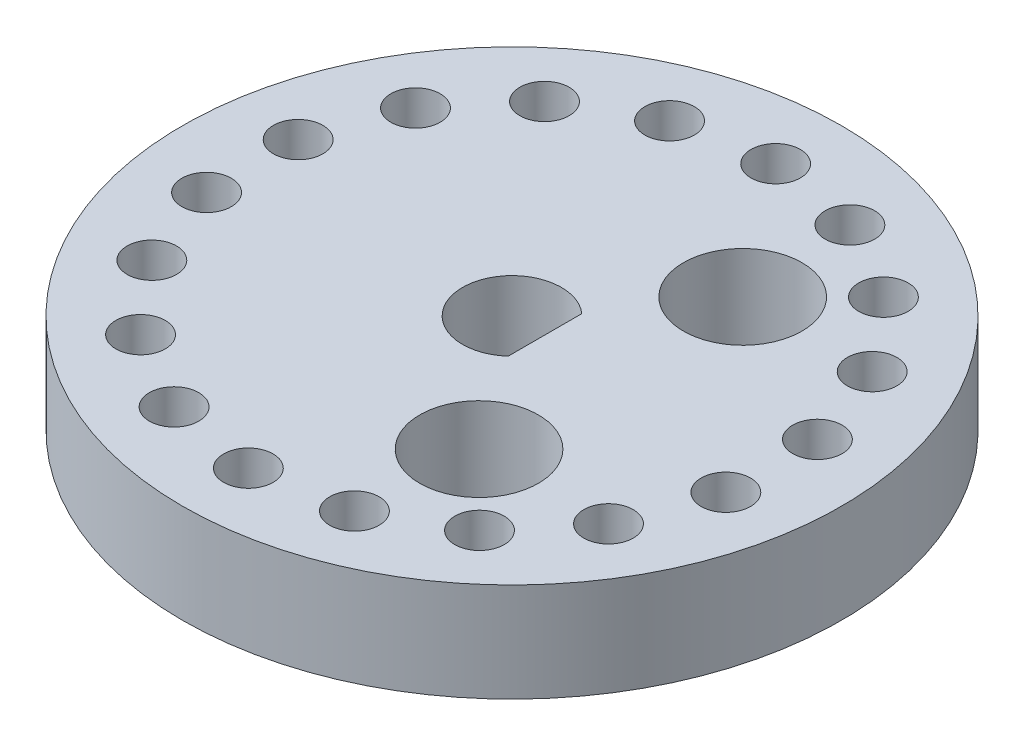
ISO-10303-21;
HEADER;
FILE_DESCRIPTION(('STEP AP214'),'2;1');
FILE_NAME('part.step','',(''),(''),'','','');
FILE_SCHEMA(('AUTOMOTIVE_DESIGN { 1 0 10303 214 1 1 1 1 }'));
ENDSEC;
DATA;
#1=APPLICATION_CONTEXT('core data for automotive mechanical design processes');
#2=APPLICATION_PROTOCOL_DEFINITION('international standard','automotive_design',2000,#1);
#3=PRODUCT_CONTEXT('',#1,'mechanical');
#4=PRODUCT('Part','Part','',(#3));
#5=PRODUCT_RELATED_PRODUCT_CATEGORY('part','',(#4));
#6=PRODUCT_DEFINITION_FORMATION('','',#4);
#7=PRODUCT_DEFINITION_CONTEXT('part definition',#1,'design');
#8=PRODUCT_DEFINITION('design','',#6,#7);
#9=PRODUCT_DEFINITION_SHAPE('','',#8);
#10=(LENGTH_UNIT() NAMED_UNIT(*) SI_UNIT(.MILLI.,.METRE.));
#11=(NAMED_UNIT(*) PLANE_ANGLE_UNIT() SI_UNIT($,.RADIAN.));
#12=(NAMED_UNIT(*) SI_UNIT($,.STERADIAN.) SOLID_ANGLE_UNIT());
#13=UNCERTAINTY_MEASURE_WITH_UNIT(LENGTH_MEASURE(1.E-05),#10,'distance_accuracy_value','');
#14=(GEOMETRIC_REPRESENTATION_CONTEXT(3) GLOBAL_UNCERTAINTY_ASSIGNED_CONTEXT((#13)) GLOBAL_UNIT_ASSIGNED_CONTEXT((#10,
#11,#12)) REPRESENTATION_CONTEXT('',''));
#15=CARTESIAN_POINT('',(0.,0.,0.));
#16=DIRECTION('',(0.,0.,1.));
#17=DIRECTION('',(1.,0.,0.));
#18=AXIS2_PLACEMENT_3D('',#15,#16,#17);
#19=CARTESIAN_POINT('',(0.,3.,0.));
#20=DIRECTION('',(0.,-1.,0.));
#21=DIRECTION('',(0.,0.,-1.));
#22=AXIS2_PLACEMENT_3D('',#19,#20,#21);
#23=CYLINDRICAL_SURFACE('',#22,10.);
#24=CARTESIAN_POINT('',(0.,3.,0.));
#25=DIRECTION('',(0.,1.,0.));
#26=DIRECTION('',(0.,0.,1.));
#27=AXIS2_PLACEMENT_3D('',#24,#25,#26);
#28=CIRCLE('',#27,10.);
#29=CARTESIAN_POINT('',(0.,3.,10.));
#30=VERTEX_POINT('',#29);
#31=EDGE_CURVE('E11',#30,#30,#28,.T.);
#32=ORIENTED_EDGE('',*,*,#31,.F.);
#33=EDGE_LOOP('',(#32));
#34=FACE_BOUND('',#33,.T.);
#35=CARTESIAN_POINT('',(0.,0.,0.));
#36=DIRECTION('',(0.,1.,0.));
#37=DIRECTION('',(0.,0.,1.));
#38=AXIS2_PLACEMENT_3D('',#35,#36,#37);
#39=CIRCLE('',#38,10.);
#40=CARTESIAN_POINT('',(0.,0.,10.));
#41=VERTEX_POINT('',#40);
#42=EDGE_CURVE('E41',#41,#41,#39,.T.);
#43=ORIENTED_EDGE('',*,*,#42,.T.);
#44=EDGE_LOOP('',(#43));
#45=FACE_BOUND('',#44,.T.);
#46=ADVANCED_FACE('F38',(#34,#45),#23,.T.);
#47=CARTESIAN_POINT('',(0.,3.,0.));
#48=DIRECTION('',(0.,1.,0.));
#49=DIRECTION('',(0.,0.,1.));
#50=AXIS2_PLACEMENT_3D('',#47,#48,#49);
#51=PLANE('',#50);
#52=CARTESIAN_POINT('',(0.,3.,0.));
#53=DIRECTION('',(0.,1.,0.));
#54=DIRECTION('',(0.,0.,-1.));
#55=AXIS2_PLACEMENT_3D('',#52,#53,#54);
#56=CIRCLE('',#55,1.5);
#57=CARTESIAN_POINT('',(1.,3.,-1.1180339887499));
#58=VERTEX_POINT('',#57);
#59=CARTESIAN_POINT('',(1.,3.,1.1180339887499));
#60=VERTEX_POINT('',#59);
#61=EDGE_CURVE('E52',#58,#60,#56,.T.);
#62=ORIENTED_EDGE('',*,*,#61,.F.);
#63=DIRECTION('',(0.,0.,-1.));
#64=VECTOR('',#63,1.);
#65=CARTESIAN_POINT('',(1.,3.,1.1180339887499));
#66=LINE('',#65,#64);
#67=EDGE_CURVE('E69',#60,#58,#66,.T.);
#68=ORIENTED_EDGE('',*,*,#67,.F.);
#69=EDGE_LOOP('',(#62,#68));
#70=FACE_BOUND('',#69,.T.);
#71=CARTESIAN_POINT('',(3.,3.,4.));
#72=DIRECTION('',(0.,1.,0.));
#73=DIRECTION('',(0.,0.,1.));
#74=AXIS2_PLACEMENT_3D('',#71,#72,#73);
#75=CIRCLE('',#74,1.8);
#76=CARTESIAN_POINT('',(3.,3.,5.8));
#77=VERTEX_POINT('',#76);
#78=EDGE_CURVE('E88',#77,#77,#75,.T.);
#79=ORIENTED_EDGE('',*,*,#78,.F.);
#80=EDGE_LOOP('',(#79));
#81=FACE_BOUND('',#80,.T.);
#82=CARTESIAN_POINT('',(3.,3.,-4.));
#83=DIRECTION('',(0.,1.,0.));
#84=DIRECTION('',(0.,0.,-1.));
#85=AXIS2_PLACEMENT_3D('',#82,#83,#84);
#86=CIRCLE('',#85,1.8);
#87=CARTESIAN_POINT('',(3.,3.,-5.8));
#88=VERTEX_POINT('',#87);
#89=EDGE_CURVE('E75',#88,#88,#86,.T.);
#90=ORIENTED_EDGE('',*,*,#89,.F.);
#91=EDGE_LOOP('',(#90));
#92=FACE_BOUND('',#91,.T.);
#93=CARTESIAN_POINT('',(2.73616114660536,3.,-7.51754096628726));
#94=DIRECTION('',(0.,1.,0.));
#95=DIRECTION('',(0.,0.,1.));
#96=AXIS2_PLACEMENT_3D('',#93,#94,#95);
#97=CIRCLE('',#96,0.75);
#98=CARTESIAN_POINT('',(2.73616114660536,3.,-6.76754096628727));
#99=VERTEX_POINT('',#98);
#100=EDGE_CURVE('E106',#99,#99,#97,.T.);
#101=ORIENTED_EDGE('',*,*,#100,.F.);
#102=EDGE_LOOP('',(#101));
#103=FACE_BOUND('',#102,.T.);
#104=CARTESIAN_POINT('',(5.14230087749239,3.,-6.12835554495204));
#105=DIRECTION('',(0.,1.,0.));
#106=DIRECTION('',(0.,0.,1.));
#107=AXIS2_PLACEMENT_3D('',#104,#105,#106);
#108=CIRCLE('',#107,0.750000000000025);
#109=CARTESIAN_POINT('',(5.14230087749239,3.,-5.37835554495202));
#110=VERTEX_POINT('',#109);
#111=EDGE_CURVE('E112',#110,#110,#108,.T.);
#112=ORIENTED_EDGE('',*,*,#111,.F.);
#113=EDGE_LOOP('',(#112));
#114=FACE_BOUND('',#113,.T.);
#115=CARTESIAN_POINT('',(6.92820323027568,3.,-4.00000000000029));
#116=DIRECTION('',(0.,1.,0.));
#117=DIRECTION('',(0.,0.,1.));
#118=AXIS2_PLACEMENT_3D('',#115,#116,#117);
#119=CIRCLE('',#118,0.750000000000097);
#120=CARTESIAN_POINT('',(6.92820323027568,3.,-3.2500000000002));
#121=VERTEX_POINT('',#120);
#122=EDGE_CURVE('E118',#121,#121,#119,.T.);
#123=ORIENTED_EDGE('',*,*,#122,.F.);
#124=EDGE_LOOP('',(#123));
#125=FACE_BOUND('',#124,.T.);
#126=CARTESIAN_POINT('',(7.87846202409795,3.,-1.38918542133578));
#127=DIRECTION('',(0.,1.,0.));
#128=DIRECTION('',(0.,0.,1.));
#129=AXIS2_PLACEMENT_3D('',#126,#127,#128);
#130=CIRCLE('',#129,0.750000000000194);
#131=CARTESIAN_POINT('',(7.87846202409795,3.,-0.639185421335584));
#132=VERTEX_POINT('',#131);
#133=EDGE_CURVE('E124',#132,#132,#130,.T.);
#134=ORIENTED_EDGE('',*,*,#133,.F.);
#135=EDGE_LOOP('',(#134));
#136=FACE_BOUND('',#135,.T.);
#137=CARTESIAN_POINT('',(7.87846202409806,3.,1.38918542133511));
#138=DIRECTION('',(0.,1.,0.));
#139=DIRECTION('',(0.,0.,1.));
#140=AXIS2_PLACEMENT_3D('',#137,#138,#139);
#141=CIRCLE('',#140,0.750000000000312);
#142=CARTESIAN_POINT('',(7.87846202409806,3.,2.13918542133542));
#143=VERTEX_POINT('',#142);
#144=EDGE_CURVE('E130',#143,#143,#141,.T.);
#145=ORIENTED_EDGE('',*,*,#144,.F.);
#146=EDGE_LOOP('',(#145));
#147=FACE_BOUND('',#146,.T.);
#148=CARTESIAN_POINT('',(6.92820323027602,3.,3.9999999999997));
#149=DIRECTION('',(0.,1.,0.));
#150=DIRECTION('',(0.,0.,1.));
#151=AXIS2_PLACEMENT_3D('',#148,#149,#150);
#152=CIRCLE('',#151,0.750000000000439);
#153=CARTESIAN_POINT('',(6.92820323027602,3.,4.75000000000014));
#154=VERTEX_POINT('',#153);
#155=EDGE_CURVE('E136',#154,#154,#152,.T.);
#156=ORIENTED_EDGE('',*,*,#155,.F.);
#157=EDGE_LOOP('',(#156));
#158=FACE_BOUND('',#157,.T.);
#159=CARTESIAN_POINT('',(5.14230087749291,3.,6.12835554495161));
#160=DIRECTION('',(0.,1.,0.));
#161=DIRECTION('',(0.,0.,1.));
#162=AXIS2_PLACEMENT_3D('',#159,#160,#161);
#163=CIRCLE('',#162,0.75000000000055);
#164=CARTESIAN_POINT('',(5.14230087749291,3.,6.87835554495216));
#165=VERTEX_POINT('',#164);
#166=EDGE_CURVE('E142',#165,#165,#163,.T.);
#167=ORIENTED_EDGE('',*,*,#166,.F.);
#168=EDGE_LOOP('',(#167));
#169=FACE_BOUND('',#168,.T.);
#170=CARTESIAN_POINT('',(2.73616114660601,3.,7.51754096628715));
#171=DIRECTION('',(0.,1.,0.));
#172=DIRECTION('',(0.,0.,1.));
#173=AXIS2_PLACEMENT_3D('',#170,#171,#172);
#174=CIRCLE('',#173,0.750000000000643);
#175=CARTESIAN_POINT('',(2.73616114660601,3.,8.2675409662878));
#176=VERTEX_POINT('',#175);
#177=EDGE_CURVE('E148',#176,#176,#174,.T.);
#178=ORIENTED_EDGE('',*,*,#177,.F.);
#179=EDGE_LOOP('',(#178));
#180=FACE_BOUND('',#179,.T.);
#181=CARTESIAN_POINT('',(6.79181874011743E-13,3.,8.));
#182=DIRECTION('',(0.,1.,0.));
#183=DIRECTION('',(0.,0.,1.));
#184=AXIS2_PLACEMENT_3D('',#181,#182,#183);
#185=CIRCLE('',#184,0.750000000000703);
#186=CARTESIAN_POINT('',(6.79181874011743E-13,3.,8.7500000000007));
#187=VERTEX_POINT('',#186);
#188=EDGE_CURVE('E154',#187,#187,#185,.T.);
#189=ORIENTED_EDGE('',*,*,#188,.F.);
#190=EDGE_LOOP('',(#189));
#191=FACE_BOUND('',#190,.T.);
#192=CARTESIAN_POINT('',(-2.73616114660469,3.,7.51754096628738));
#193=DIRECTION('',(0.,1.,0.));
#194=DIRECTION('',(0.,0.,1.));
#195=AXIS2_PLACEMENT_3D('',#192,#193,#194);
#196=CIRCLE('',#195,0.750000000000721);
#197=CARTESIAN_POINT('',(-2.73616114660469,3.,8.26754096628811));
#198=VERTEX_POINT('',#197);
#199=EDGE_CURVE('E160',#198,#198,#196,.T.);
#200=ORIENTED_EDGE('',*,*,#199,.F.);
#201=EDGE_LOOP('',(#200));
#202=FACE_BOUND('',#201,.T.);
#203=CARTESIAN_POINT('',(-5.14230087749172,3.,6.12835554495204));
#204=DIRECTION('',(0.,1.,0.));
#205=DIRECTION('',(0.,0.,1.));
#206=AXIS2_PLACEMENT_3D('',#203,#204,#205);
#207=CIRCLE('',#206,0.750000000000701);
#208=CARTESIAN_POINT('',(-5.14230087749172,3.,6.87835554495274));
#209=VERTEX_POINT('',#208);
#210=EDGE_CURVE('E166',#209,#209,#207,.T.);
#211=ORIENTED_EDGE('',*,*,#210,.F.);
#212=EDGE_LOOP('',(#211));
#213=FACE_BOUND('',#212,.T.);
#214=CARTESIAN_POINT('',(-6.928203230275,3.,4.0000000000003));
#215=DIRECTION('',(0.,1.,0.));
#216=DIRECTION('',(0.,0.,1.));
#217=AXIS2_PLACEMENT_3D('',#214,#215,#216);
#218=CIRCLE('',#217,0.750000000000646);
#219=CARTESIAN_POINT('',(-6.928203230275,3.,4.75000000000094));
#220=VERTEX_POINT('',#219);
#221=EDGE_CURVE('E172',#220,#220,#218,.T.);
#222=ORIENTED_EDGE('',*,*,#221,.F.);
#223=EDGE_LOOP('',(#222));
#224=FACE_BOUND('',#223,.T.);
#225=CARTESIAN_POINT('',(-7.87846202409727,3.,1.38918542133578));
#226=DIRECTION('',(0.,1.,0.));
#227=DIRECTION('',(0.,0.,1.));
#228=AXIS2_PLACEMENT_3D('',#225,#226,#227);
#229=CIRCLE('',#228,0.750000000000553);
#230=CARTESIAN_POINT('',(-7.87846202409727,3.,2.13918542133633));
#231=VERTEX_POINT('',#230);
#232=EDGE_CURVE('E178',#231,#231,#229,.T.);
#233=ORIENTED_EDGE('',*,*,#232,.F.);
#234=EDGE_LOOP('',(#233));
#235=FACE_BOUND('',#234,.T.);
#236=CARTESIAN_POINT('',(-7.87846202409738,3.,-1.38918542133511));
#237=DIRECTION('',(0.,1.,0.));
#238=DIRECTION('',(0.,0.,1.));
#239=AXIS2_PLACEMENT_3D('',#236,#237,#238);
#240=CIRCLE('',#239,0.750000000000447);
#241=CARTESIAN_POINT('',(-7.87846202409738,3.,-0.639185421334659));
#242=VERTEX_POINT('',#241);
#243=EDGE_CURVE('E184',#242,#242,#240,.T.);
#244=ORIENTED_EDGE('',*,*,#243,.F.);
#245=EDGE_LOOP('',(#244));
#246=FACE_BOUND('',#245,.T.);
#247=CARTESIAN_POINT('',(-6.92820323027534,3.,-3.99999999999971));
#248=DIRECTION('',(0.,1.,0.));
#249=DIRECTION('',(0.,0.,1.));
#250=AXIS2_PLACEMENT_3D('',#247,#248,#249);
#251=CIRCLE('',#250,0.750000000000337);
#252=CARTESIAN_POINT('',(-6.92820323027534,3.,-3.24999999999937));
#253=VERTEX_POINT('',#252);
#254=EDGE_CURVE('E190',#253,#253,#251,.T.);
#255=ORIENTED_EDGE('',*,*,#254,.F.);
#256=EDGE_LOOP('',(#255));
#257=FACE_BOUND('',#256,.T.);
#258=CARTESIAN_POINT('',(-5.14230087749224,3.,-6.1283555449516));
#259=DIRECTION('',(0.,1.,0.));
#260=DIRECTION('',(0.,0.,1.));
#261=AXIS2_PLACEMENT_3D('',#258,#259,#260);
#262=CIRCLE('',#261,0.750000000000235);
#263=CARTESIAN_POINT('',(-5.14230087749224,3.,-5.37835554495137));
#264=VERTEX_POINT('',#263);
#265=EDGE_CURVE('E99',#264,#264,#262,.T.);
#266=ORIENTED_EDGE('',*,*,#265,.F.);
#267=EDGE_LOOP('',(#266));
#268=FACE_BOUND('',#267,.T.);
#269=CARTESIAN_POINT('',(-2.73616114660526,3.,-7.5175409662873));
#270=DIRECTION('',(0.,1.,0.));
#271=DIRECTION('',(0.,0.,1.));
#272=AXIS2_PLACEMENT_3D('',#269,#270,#271);
#273=CIRCLE('',#272,0.75);
#274=CARTESIAN_POINT('',(-2.73616114660526,3.,-6.7675409662873));
#275=VERTEX_POINT('',#274);
#276=EDGE_CURVE('E87',#275,#275,#273,.T.);
#277=ORIENTED_EDGE('',*,*,#276,.F.);
#278=EDGE_LOOP('',(#277));
#279=FACE_BOUND('',#278,.T.);
#280=CARTESIAN_POINT('',(0.,3.,-8.));
#281=DIRECTION('',(0.,1.,0.));
#282=DIRECTION('',(0.,0.,1.));
#283=AXIS2_PLACEMENT_3D('',#280,#281,#282);
#284=CIRCLE('',#283,0.75);
#285=CARTESIAN_POINT('',(0.,3.,-7.25));
#286=VERTEX_POINT('',#285);
#287=EDGE_CURVE('E105',#286,#286,#284,.T.);
#288=ORIENTED_EDGE('',*,*,#287,.F.);
#289=EDGE_LOOP('',(#288));
#290=FACE_BOUND('',#289,.T.);
#291=ORIENTED_EDGE('',*,*,#31,.T.);
#292=EDGE_LOOP('',(#291));
#293=FACE_BOUND('',#292,.T.);
#294=ADVANCED_FACE('F206',(#70,#81,#92,#103,#114,#125,#136,#147,#158,#169,#180,#191,#202,#213,
#224,#235,#246,#257,#268,#279,#290,#293),#51,.T.);
#295=CARTESIAN_POINT('',(0.,0.,0.));
#296=DIRECTION('',(0.,1.,0.));
#297=DIRECTION('',(0.,0.,1.));
#298=AXIS2_PLACEMENT_3D('',#295,#296,#297);
#299=PLANE('',#298);
#300=DIRECTION('',(0.,0.,1.));
#301=VECTOR('',#300,1.);
#302=CARTESIAN_POINT('',(1.,0.,1.1180339887499));
#303=LINE('',#302,#301);
#304=CARTESIAN_POINT('',(1.,0.,-1.1180339887499));
#305=VERTEX_POINT('',#304);
#306=CARTESIAN_POINT('',(1.,0.,1.1180339887499));
#307=VERTEX_POINT('',#306);
#308=EDGE_CURVE('E72',#305,#307,#303,.T.);
#309=ORIENTED_EDGE('',*,*,#308,.F.);
#310=CARTESIAN_POINT('',(0.,0.,0.));
#311=DIRECTION('',(0.,1.,0.));
#312=DIRECTION('',(0.,0.,1.));
#313=AXIS2_PLACEMENT_3D('',#310,#311,#312);
#314=CIRCLE('',#313,1.5);
#315=EDGE_CURVE('E57',#307,#305,#314,.F.);
#316=ORIENTED_EDGE('',*,*,#315,.F.);
#317=EDGE_LOOP('',(#309,#316));
#318=FACE_BOUND('',#317,.T.);
#319=CARTESIAN_POINT('',(3.,0.,4.));
#320=DIRECTION('',(0.,1.,0.));
#321=DIRECTION('',(0.,0.,1.));
#322=AXIS2_PLACEMENT_3D('',#319,#320,#321);
#323=CIRCLE('',#322,1.8);
#324=CARTESIAN_POINT('',(3.,0.,5.8));
#325=VERTEX_POINT('',#324);
#326=EDGE_CURVE('E84',#325,#325,#323,.T.);
#327=ORIENTED_EDGE('',*,*,#326,.T.);
#328=EDGE_LOOP('',(#327));
#329=FACE_BOUND('',#328,.T.);
#330=CARTESIAN_POINT('',(3.,0.,-4.));
#331=DIRECTION('',(0.,1.,0.));
#332=DIRECTION('',(0.,0.,-1.));
#333=AXIS2_PLACEMENT_3D('',#330,#331,#332);
#334=CIRCLE('',#333,1.8);
#335=CARTESIAN_POINT('',(3.,0.,-5.8));
#336=VERTEX_POINT('',#335);
#337=EDGE_CURVE('E91',#336,#336,#334,.T.);
#338=ORIENTED_EDGE('',*,*,#337,.T.);
#339=EDGE_LOOP('',(#338));
#340=FACE_BOUND('',#339,.T.);
#341=CARTESIAN_POINT('',(2.73616114660536,0.,-7.51754096628726));
#342=DIRECTION('',(0.,1.,0.));
#343=DIRECTION('',(0.,0.,1.));
#344=AXIS2_PLACEMENT_3D('',#341,#342,#343);
#345=CIRCLE('',#344,0.75);
#346=CARTESIAN_POINT('',(2.73616114660536,0.,-6.76754096628727));
#347=VERTEX_POINT('',#346);
#348=EDGE_CURVE('E102',#347,#347,#345,.T.);
#349=ORIENTED_EDGE('',*,*,#348,.T.);
#350=EDGE_LOOP('',(#349));
#351=FACE_BOUND('',#350,.T.);
#352=CARTESIAN_POINT('',(5.14230087749239,0.,-6.12835554495204));
#353=DIRECTION('',(0.,1.,0.));
#354=DIRECTION('',(0.,0.,1.));
#355=AXIS2_PLACEMENT_3D('',#352,#353,#354);
#356=CIRCLE('',#355,0.750000000000025);
#357=CARTESIAN_POINT('',(5.14230087749239,0.,-5.37835554495202));
#358=VERTEX_POINT('',#357);
#359=EDGE_CURVE('E109',#358,#358,#356,.T.);
#360=ORIENTED_EDGE('',*,*,#359,.T.);
#361=EDGE_LOOP('',(#360));
#362=FACE_BOUND('',#361,.T.);
#363=CARTESIAN_POINT('',(6.92820323027568,0.,-4.00000000000029));
#364=DIRECTION('',(0.,1.,0.));
#365=DIRECTION('',(0.,0.,1.));
#366=AXIS2_PLACEMENT_3D('',#363,#364,#365);
#367=CIRCLE('',#366,0.750000000000097);
#368=CARTESIAN_POINT('',(6.92820323027568,0.,-3.2500000000002));
#369=VERTEX_POINT('',#368);
#370=EDGE_CURVE('E115',#369,#369,#367,.T.);
#371=ORIENTED_EDGE('',*,*,#370,.T.);
#372=EDGE_LOOP('',(#371));
#373=FACE_BOUND('',#372,.T.);
#374=CARTESIAN_POINT('',(7.87846202409795,0.,-1.38918542133578));
#375=DIRECTION('',(0.,1.,0.));
#376=DIRECTION('',(0.,0.,1.));
#377=AXIS2_PLACEMENT_3D('',#374,#375,#376);
#378=CIRCLE('',#377,0.750000000000194);
#379=CARTESIAN_POINT('',(7.87846202409795,0.,-0.639185421335584));
#380=VERTEX_POINT('',#379);
#381=EDGE_CURVE('E121',#380,#380,#378,.T.);
#382=ORIENTED_EDGE('',*,*,#381,.T.);
#383=EDGE_LOOP('',(#382));
#384=FACE_BOUND('',#383,.T.);
#385=CARTESIAN_POINT('',(7.87846202409806,0.,1.38918542133511));
#386=DIRECTION('',(0.,1.,0.));
#387=DIRECTION('',(0.,0.,1.));
#388=AXIS2_PLACEMENT_3D('',#385,#386,#387);
#389=CIRCLE('',#388,0.750000000000312);
#390=CARTESIAN_POINT('',(7.87846202409806,0.,2.13918542133542));
#391=VERTEX_POINT('',#390);
#392=EDGE_CURVE('E127',#391,#391,#389,.T.);
#393=ORIENTED_EDGE('',*,*,#392,.T.);
#394=EDGE_LOOP('',(#393));
#395=FACE_BOUND('',#394,.T.);
#396=CARTESIAN_POINT('',(6.92820323027602,0.,3.9999999999997));
#397=DIRECTION('',(0.,1.,0.));
#398=DIRECTION('',(0.,0.,1.));
#399=AXIS2_PLACEMENT_3D('',#396,#397,#398);
#400=CIRCLE('',#399,0.750000000000439);
#401=CARTESIAN_POINT('',(6.92820323027602,0.,4.75000000000014));
#402=VERTEX_POINT('',#401);
#403=EDGE_CURVE('E133',#402,#402,#400,.T.);
#404=ORIENTED_EDGE('',*,*,#403,.T.);
#405=EDGE_LOOP('',(#404));
#406=FACE_BOUND('',#405,.T.);
#407=CARTESIAN_POINT('',(5.14230087749291,0.,6.12835554495161));
#408=DIRECTION('',(0.,1.,0.));
#409=DIRECTION('',(0.,0.,1.));
#410=AXIS2_PLACEMENT_3D('',#407,#408,#409);
#411=CIRCLE('',#410,0.75000000000055);
#412=CARTESIAN_POINT('',(5.14230087749291,0.,6.87835554495216));
#413=VERTEX_POINT('',#412);
#414=EDGE_CURVE('E139',#413,#413,#411,.T.);
#415=ORIENTED_EDGE('',*,*,#414,.T.);
#416=EDGE_LOOP('',(#415));
#417=FACE_BOUND('',#416,.T.);
#418=CARTESIAN_POINT('',(2.73616114660601,0.,7.51754096628715));
#419=DIRECTION('',(0.,1.,0.));
#420=DIRECTION('',(0.,0.,1.));
#421=AXIS2_PLACEMENT_3D('',#418,#419,#420);
#422=CIRCLE('',#421,0.750000000000643);
#423=CARTESIAN_POINT('',(2.73616114660601,0.,8.2675409662878));
#424=VERTEX_POINT('',#423);
#425=EDGE_CURVE('E145',#424,#424,#422,.T.);
#426=ORIENTED_EDGE('',*,*,#425,.T.);
#427=EDGE_LOOP('',(#426));
#428=FACE_BOUND('',#427,.T.);
#429=CARTESIAN_POINT('',(6.79181874011743E-13,0.,8.));
#430=DIRECTION('',(0.,1.,0.));
#431=DIRECTION('',(0.,0.,1.));
#432=AXIS2_PLACEMENT_3D('',#429,#430,#431);
#433=CIRCLE('',#432,0.750000000000703);
#434=CARTESIAN_POINT('',(6.79181874011743E-13,0.,8.7500000000007));
#435=VERTEX_POINT('',#434);
#436=EDGE_CURVE('E151',#435,#435,#433,.T.);
#437=ORIENTED_EDGE('',*,*,#436,.T.);
#438=EDGE_LOOP('',(#437));
#439=FACE_BOUND('',#438,.T.);
#440=CARTESIAN_POINT('',(-2.73616114660469,0.,7.51754096628738));
#441=DIRECTION('',(0.,1.,0.));
#442=DIRECTION('',(0.,0.,1.));
#443=AXIS2_PLACEMENT_3D('',#440,#441,#442);
#444=CIRCLE('',#443,0.750000000000721);
#445=CARTESIAN_POINT('',(-2.73616114660469,0.,8.26754096628811));
#446=VERTEX_POINT('',#445);
#447=EDGE_CURVE('E157',#446,#446,#444,.T.);
#448=ORIENTED_EDGE('',*,*,#447,.T.);
#449=EDGE_LOOP('',(#448));
#450=FACE_BOUND('',#449,.T.);
#451=CARTESIAN_POINT('',(-5.14230087749172,0.,6.12835554495204));
#452=DIRECTION('',(0.,1.,0.));
#453=DIRECTION('',(0.,0.,1.));
#454=AXIS2_PLACEMENT_3D('',#451,#452,#453);
#455=CIRCLE('',#454,0.750000000000701);
#456=CARTESIAN_POINT('',(-5.14230087749172,0.,6.87835554495274));
#457=VERTEX_POINT('',#456);
#458=EDGE_CURVE('E163',#457,#457,#455,.T.);
#459=ORIENTED_EDGE('',*,*,#458,.T.);
#460=EDGE_LOOP('',(#459));
#461=FACE_BOUND('',#460,.T.);
#462=CARTESIAN_POINT('',(-6.928203230275,0.,4.0000000000003));
#463=DIRECTION('',(0.,1.,0.));
#464=DIRECTION('',(0.,0.,1.));
#465=AXIS2_PLACEMENT_3D('',#462,#463,#464);
#466=CIRCLE('',#465,0.750000000000646);
#467=CARTESIAN_POINT('',(-6.928203230275,0.,4.75000000000094));
#468=VERTEX_POINT('',#467);
#469=EDGE_CURVE('E169',#468,#468,#466,.T.);
#470=ORIENTED_EDGE('',*,*,#469,.T.);
#471=EDGE_LOOP('',(#470));
#472=FACE_BOUND('',#471,.T.);
#473=CARTESIAN_POINT('',(-7.87846202409727,0.,1.38918542133578));
#474=DIRECTION('',(0.,1.,0.));
#475=DIRECTION('',(0.,0.,1.));
#476=AXIS2_PLACEMENT_3D('',#473,#474,#475);
#477=CIRCLE('',#476,0.750000000000553);
#478=CARTESIAN_POINT('',(-7.87846202409727,0.,2.13918542133633));
#479=VERTEX_POINT('',#478);
#480=EDGE_CURVE('E175',#479,#479,#477,.T.);
#481=ORIENTED_EDGE('',*,*,#480,.T.);
#482=EDGE_LOOP('',(#481));
#483=FACE_BOUND('',#482,.T.);
#484=CARTESIAN_POINT('',(-7.87846202409738,0.,-1.38918542133511));
#485=DIRECTION('',(0.,1.,0.));
#486=DIRECTION('',(0.,0.,1.));
#487=AXIS2_PLACEMENT_3D('',#484,#485,#486);
#488=CIRCLE('',#487,0.750000000000447);
#489=CARTESIAN_POINT('',(-7.87846202409738,0.,-0.639185421334659));
#490=VERTEX_POINT('',#489);
#491=EDGE_CURVE('E181',#490,#490,#488,.T.);
#492=ORIENTED_EDGE('',*,*,#491,.T.);
#493=EDGE_LOOP('',(#492));
#494=FACE_BOUND('',#493,.T.);
#495=CARTESIAN_POINT('',(-6.92820323027534,0.,-3.99999999999971));
#496=DIRECTION('',(0.,1.,0.));
#497=DIRECTION('',(0.,0.,1.));
#498=AXIS2_PLACEMENT_3D('',#495,#496,#497);
#499=CIRCLE('',#498,0.750000000000337);
#500=CARTESIAN_POINT('',(-6.92820323027534,0.,-3.24999999999937));
#501=VERTEX_POINT('',#500);
#502=EDGE_CURVE('E187',#501,#501,#499,.T.);
#503=ORIENTED_EDGE('',*,*,#502,.T.);
#504=EDGE_LOOP('',(#503));
#505=FACE_BOUND('',#504,.T.);
#506=CARTESIAN_POINT('',(-5.14230087749224,0.,-6.1283555449516));
#507=DIRECTION('',(0.,1.,0.));
#508=DIRECTION('',(0.,0.,1.));
#509=AXIS2_PLACEMENT_3D('',#506,#507,#508);
#510=CIRCLE('',#509,0.750000000000235);
#511=CARTESIAN_POINT('',(-5.14230087749224,0.,-5.37835554495137));
#512=VERTEX_POINT('',#511);
#513=EDGE_CURVE('E193',#512,#512,#510,.T.);
#514=ORIENTED_EDGE('',*,*,#513,.T.);
#515=EDGE_LOOP('',(#514));
#516=FACE_BOUND('',#515,.T.);
#517=CARTESIAN_POINT('',(-2.73616114660526,0.,-7.5175409662873));
#518=DIRECTION('',(0.,1.,0.));
#519=DIRECTION('',(0.,0.,1.));
#520=AXIS2_PLACEMENT_3D('',#517,#518,#519);
#521=CIRCLE('',#520,0.75);
#522=CARTESIAN_POINT('',(-2.73616114660526,0.,-6.7675409662873));
#523=VERTEX_POINT('',#522);
#524=EDGE_CURVE('E96',#523,#523,#521,.T.);
#525=ORIENTED_EDGE('',*,*,#524,.T.);
#526=EDGE_LOOP('',(#525));
#527=FACE_BOUND('',#526,.T.);
#528=CARTESIAN_POINT('',(0.,0.,-8.));
#529=DIRECTION('',(0.,1.,0.));
#530=DIRECTION('',(0.,0.,1.));
#531=AXIS2_PLACEMENT_3D('',#528,#529,#530);
#532=CIRCLE('',#531,0.75);
#533=CARTESIAN_POINT('',(0.,0.,-7.25));
#534=VERTEX_POINT('',#533);
#535=EDGE_CURVE('E198',#534,#534,#532,.T.);
#536=ORIENTED_EDGE('',*,*,#535,.T.);
#537=EDGE_LOOP('',(#536));
#538=FACE_BOUND('',#537,.T.);
#539=ORIENTED_EDGE('',*,*,#42,.F.);
#540=EDGE_LOOP('',(#539));
#541=FACE_BOUND('',#540,.T.);
#542=ADVANCED_FACE('F77',(#318,#329,#340,#351,#362,#373,#384,#395,#406,#417,#428,#439,#450,#461,
#472,#483,#494,#505,#516,#527,#538,#541),#299,.F.);
#543=CARTESIAN_POINT('',(0.,0.,-8.));
#544=DIRECTION('',(0.,1.,0.));
#545=DIRECTION('',(0.,0.,1.));
#546=AXIS2_PLACEMENT_3D('',#543,#544,#545);
#547=CYLINDRICAL_SURFACE('',#546,0.75);
#548=ORIENTED_EDGE('',*,*,#535,.F.);
#549=EDGE_LOOP('',(#548));
#550=FACE_BOUND('',#549,.T.);
#551=ORIENTED_EDGE('',*,*,#287,.T.);
#552=EDGE_LOOP('',(#551));
#553=FACE_BOUND('',#552,.T.);
#554=ADVANCED_FACE('F204',(#550,#553),#547,.F.);
#555=CARTESIAN_POINT('',(-2.73616114660526,0.,-7.5175409662873));
#556=DIRECTION('',(0.,1.,0.));
#557=DIRECTION('',(0.,0.,1.));
#558=AXIS2_PLACEMENT_3D('',#555,#556,#557);
#559=CYLINDRICAL_SURFACE('',#558,0.75);
#560=ORIENTED_EDGE('',*,*,#524,.F.);
#561=EDGE_LOOP('',(#560));
#562=FACE_BOUND('',#561,.T.);
#563=ORIENTED_EDGE('',*,*,#276,.T.);
#564=EDGE_LOOP('',(#563));
#565=FACE_BOUND('',#564,.T.);
#566=ADVANCED_FACE('F222',(#562,#565),#559,.F.);
#567=CARTESIAN_POINT('',(-5.14230087749224,0.,-6.1283555449516));
#568=DIRECTION('',(0.,1.,0.));
#569=DIRECTION('',(0.,0.,1.));
#570=AXIS2_PLACEMENT_3D('',#567,#568,#569);
#571=CYLINDRICAL_SURFACE('',#570,0.750000000000235);
#572=ORIENTED_EDGE('',*,*,#513,.F.);
#573=EDGE_LOOP('',(#572));
#574=FACE_BOUND('',#573,.T.);
#575=ORIENTED_EDGE('',*,*,#265,.T.);
#576=EDGE_LOOP('',(#575));
#577=FACE_BOUND('',#576,.T.);
#578=ADVANCED_FACE('F226',(#574,#577),#571,.F.);
#579=CARTESIAN_POINT('',(-6.92820323027534,0.,-3.99999999999971));
#580=DIRECTION('',(0.,1.,0.));
#581=DIRECTION('',(0.,0.,1.));
#582=AXIS2_PLACEMENT_3D('',#579,#580,#581);
#583=CYLINDRICAL_SURFACE('',#582,0.750000000000337);
#584=ORIENTED_EDGE('',*,*,#502,.F.);
#585=EDGE_LOOP('',(#584));
#586=FACE_BOUND('',#585,.T.);
#587=ORIENTED_EDGE('',*,*,#254,.T.);
#588=EDGE_LOOP('',(#587));
#589=FACE_BOUND('',#588,.T.);
#590=ADVANCED_FACE('F229',(#586,#589),#583,.F.);
#591=CARTESIAN_POINT('',(-7.87846202409738,0.,-1.38918542133511));
#592=DIRECTION('',(0.,1.,0.));
#593=DIRECTION('',(0.,0.,1.));
#594=AXIS2_PLACEMENT_3D('',#591,#592,#593);
#595=CYLINDRICAL_SURFACE('',#594,0.750000000000447);
#596=ORIENTED_EDGE('',*,*,#491,.F.);
#597=EDGE_LOOP('',(#596));
#598=FACE_BOUND('',#597,.T.);
#599=ORIENTED_EDGE('',*,*,#243,.T.);
#600=EDGE_LOOP('',(#599));
#601=FACE_BOUND('',#600,.T.);
#602=ADVANCED_FACE('F233',(#598,#601),#595,.F.);
#603=CARTESIAN_POINT('',(-7.87846202409727,0.,1.38918542133578));
#604=DIRECTION('',(0.,1.,0.));
#605=DIRECTION('',(0.,0.,1.));
#606=AXIS2_PLACEMENT_3D('',#603,#604,#605);
#607=CYLINDRICAL_SURFACE('',#606,0.750000000000553);
#608=ORIENTED_EDGE('',*,*,#480,.F.);
#609=EDGE_LOOP('',(#608));
#610=FACE_BOUND('',#609,.T.);
#611=ORIENTED_EDGE('',*,*,#232,.T.);
#612=EDGE_LOOP('',(#611));
#613=FACE_BOUND('',#612,.T.);
#614=ADVANCED_FACE('F237',(#610,#613),#607,.F.);
#615=CARTESIAN_POINT('',(-6.928203230275,0.,4.0000000000003));
#616=DIRECTION('',(0.,1.,0.));
#617=DIRECTION('',(0.,0.,1.));
#618=AXIS2_PLACEMENT_3D('',#615,#616,#617);
#619=CYLINDRICAL_SURFACE('',#618,0.750000000000646);
#620=ORIENTED_EDGE('',*,*,#469,.F.);
#621=EDGE_LOOP('',(#620));
#622=FACE_BOUND('',#621,.T.);
#623=ORIENTED_EDGE('',*,*,#221,.T.);
#624=EDGE_LOOP('',(#623));
#625=FACE_BOUND('',#624,.T.);
#626=ADVANCED_FACE('F241',(#622,#625),#619,.F.);
#627=CARTESIAN_POINT('',(-5.14230087749172,0.,6.12835554495204));
#628=DIRECTION('',(0.,1.,0.));
#629=DIRECTION('',(0.,0.,1.));
#630=AXIS2_PLACEMENT_3D('',#627,#628,#629);
#631=CYLINDRICAL_SURFACE('',#630,0.750000000000701);
#632=ORIENTED_EDGE('',*,*,#458,.F.);
#633=EDGE_LOOP('',(#632));
#634=FACE_BOUND('',#633,.T.);
#635=ORIENTED_EDGE('',*,*,#210,.T.);
#636=EDGE_LOOP('',(#635));
#637=FACE_BOUND('',#636,.T.);
#638=ADVANCED_FACE('F245',(#634,#637),#631,.F.);
#639=CARTESIAN_POINT('',(-2.73616114660469,0.,7.51754096628738));
#640=DIRECTION('',(0.,1.,0.));
#641=DIRECTION('',(0.,0.,1.));
#642=AXIS2_PLACEMENT_3D('',#639,#640,#641);
#643=CYLINDRICAL_SURFACE('',#642,0.750000000000721);
#644=ORIENTED_EDGE('',*,*,#447,.F.);
#645=EDGE_LOOP('',(#644));
#646=FACE_BOUND('',#645,.T.);
#647=ORIENTED_EDGE('',*,*,#199,.T.);
#648=EDGE_LOOP('',(#647));
#649=FACE_BOUND('',#648,.T.);
#650=ADVANCED_FACE('F249',(#646,#649),#643,.F.);
#651=CARTESIAN_POINT('',(6.79181874011743E-13,0.,8.));
#652=DIRECTION('',(0.,1.,0.));
#653=DIRECTION('',(0.,0.,1.));
#654=AXIS2_PLACEMENT_3D('',#651,#652,#653);
#655=CYLINDRICAL_SURFACE('',#654,0.750000000000703);
#656=ORIENTED_EDGE('',*,*,#436,.F.);
#657=EDGE_LOOP('',(#656));
#658=FACE_BOUND('',#657,.T.);
#659=ORIENTED_EDGE('',*,*,#188,.T.);
#660=EDGE_LOOP('',(#659));
#661=FACE_BOUND('',#660,.T.);
#662=ADVANCED_FACE('F253',(#658,#661),#655,.F.);
#663=CARTESIAN_POINT('',(2.73616114660601,0.,7.51754096628715));
#664=DIRECTION('',(0.,1.,0.));
#665=DIRECTION('',(0.,0.,1.));
#666=AXIS2_PLACEMENT_3D('',#663,#664,#665);
#667=CYLINDRICAL_SURFACE('',#666,0.750000000000643);
#668=ORIENTED_EDGE('',*,*,#425,.F.);
#669=EDGE_LOOP('',(#668));
#670=FACE_BOUND('',#669,.T.);
#671=ORIENTED_EDGE('',*,*,#177,.T.);
#672=EDGE_LOOP('',(#671));
#673=FACE_BOUND('',#672,.T.);
#674=ADVANCED_FACE('F257',(#670,#673),#667,.F.);
#675=CARTESIAN_POINT('',(5.14230087749291,0.,6.12835554495161));
#676=DIRECTION('',(0.,1.,0.));
#677=DIRECTION('',(0.,0.,1.));
#678=AXIS2_PLACEMENT_3D('',#675,#676,#677);
#679=CYLINDRICAL_SURFACE('',#678,0.75000000000055);
#680=ORIENTED_EDGE('',*,*,#414,.F.);
#681=EDGE_LOOP('',(#680));
#682=FACE_BOUND('',#681,.T.);
#683=ORIENTED_EDGE('',*,*,#166,.T.);
#684=EDGE_LOOP('',(#683));
#685=FACE_BOUND('',#684,.T.);
#686=ADVANCED_FACE('F261',(#682,#685),#679,.F.);
#687=CARTESIAN_POINT('',(6.92820323027602,0.,3.9999999999997));
#688=DIRECTION('',(0.,1.,0.));
#689=DIRECTION('',(0.,0.,1.));
#690=AXIS2_PLACEMENT_3D('',#687,#688,#689);
#691=CYLINDRICAL_SURFACE('',#690,0.750000000000439);
#692=ORIENTED_EDGE('',*,*,#403,.F.);
#693=EDGE_LOOP('',(#692));
#694=FACE_BOUND('',#693,.T.);
#695=ORIENTED_EDGE('',*,*,#155,.T.);
#696=EDGE_LOOP('',(#695));
#697=FACE_BOUND('',#696,.T.);
#698=ADVANCED_FACE('F265',(#694,#697),#691,.F.);
#699=CARTESIAN_POINT('',(7.87846202409806,0.,1.38918542133511));
#700=DIRECTION('',(0.,1.,0.));
#701=DIRECTION('',(0.,0.,1.));
#702=AXIS2_PLACEMENT_3D('',#699,#700,#701);
#703=CYLINDRICAL_SURFACE('',#702,0.750000000000312);
#704=ORIENTED_EDGE('',*,*,#392,.F.);
#705=EDGE_LOOP('',(#704));
#706=FACE_BOUND('',#705,.T.);
#707=ORIENTED_EDGE('',*,*,#144,.T.);
#708=EDGE_LOOP('',(#707));
#709=FACE_BOUND('',#708,.T.);
#710=ADVANCED_FACE('F269',(#706,#709),#703,.F.);
#711=CARTESIAN_POINT('',(7.87846202409795,0.,-1.38918542133578));
#712=DIRECTION('',(0.,1.,0.));
#713=DIRECTION('',(0.,0.,1.));
#714=AXIS2_PLACEMENT_3D('',#711,#712,#713);
#715=CYLINDRICAL_SURFACE('',#714,0.750000000000194);
#716=ORIENTED_EDGE('',*,*,#381,.F.);
#717=EDGE_LOOP('',(#716));
#718=FACE_BOUND('',#717,.T.);
#719=ORIENTED_EDGE('',*,*,#133,.T.);
#720=EDGE_LOOP('',(#719));
#721=FACE_BOUND('',#720,.T.);
#722=ADVANCED_FACE('F273',(#718,#721),#715,.F.);
#723=CARTESIAN_POINT('',(6.92820323027568,0.,-4.00000000000029));
#724=DIRECTION('',(0.,1.,0.));
#725=DIRECTION('',(0.,0.,1.));
#726=AXIS2_PLACEMENT_3D('',#723,#724,#725);
#727=CYLINDRICAL_SURFACE('',#726,0.750000000000097);
#728=ORIENTED_EDGE('',*,*,#370,.F.);
#729=EDGE_LOOP('',(#728));
#730=FACE_BOUND('',#729,.T.);
#731=ORIENTED_EDGE('',*,*,#122,.T.);
#732=EDGE_LOOP('',(#731));
#733=FACE_BOUND('',#732,.T.);
#734=ADVANCED_FACE('F277',(#730,#733),#727,.F.);
#735=CARTESIAN_POINT('',(5.14230087749239,0.,-6.12835554495204));
#736=DIRECTION('',(0.,1.,0.));
#737=DIRECTION('',(0.,0.,1.));
#738=AXIS2_PLACEMENT_3D('',#735,#736,#737);
#739=CYLINDRICAL_SURFACE('',#738,0.750000000000025);
#740=ORIENTED_EDGE('',*,*,#359,.F.);
#741=EDGE_LOOP('',(#740));
#742=FACE_BOUND('',#741,.T.);
#743=ORIENTED_EDGE('',*,*,#111,.T.);
#744=EDGE_LOOP('',(#743));
#745=FACE_BOUND('',#744,.T.);
#746=ADVANCED_FACE('F281',(#742,#745),#739,.F.);
#747=CARTESIAN_POINT('',(2.73616114660536,0.,-7.51754096628726));
#748=DIRECTION('',(0.,1.,0.));
#749=DIRECTION('',(0.,0.,1.));
#750=AXIS2_PLACEMENT_3D('',#747,#748,#749);
#751=CYLINDRICAL_SURFACE('',#750,0.75);
#752=ORIENTED_EDGE('',*,*,#348,.F.);
#753=EDGE_LOOP('',(#752));
#754=FACE_BOUND('',#753,.T.);
#755=ORIENTED_EDGE('',*,*,#100,.T.);
#756=EDGE_LOOP('',(#755));
#757=FACE_BOUND('',#756,.T.);
#758=ADVANCED_FACE('F285',(#754,#757),#751,.F.);
#759=CARTESIAN_POINT('',(3.,0.,-4.));
#760=DIRECTION('',(0.,1.,0.));
#761=DIRECTION('',(0.,0.,1.));
#762=AXIS2_PLACEMENT_3D('',#759,#760,#761);
#763=CYLINDRICAL_SURFACE('',#762,1.8);
#764=ORIENTED_EDGE('',*,*,#337,.F.);
#765=EDGE_LOOP('',(#764));
#766=FACE_BOUND('',#765,.T.);
#767=ORIENTED_EDGE('',*,*,#89,.T.);
#768=EDGE_LOOP('',(#767));
#769=FACE_BOUND('',#768,.T.);
#770=ADVANCED_FACE('F289',(#766,#769),#763,.F.);
#771=CARTESIAN_POINT('',(3.,0.,4.));
#772=DIRECTION('',(0.,1.,0.));
#773=DIRECTION('',(0.,0.,1.));
#774=AXIS2_PLACEMENT_3D('',#771,#772,#773);
#775=CYLINDRICAL_SURFACE('',#774,1.8);
#776=ORIENTED_EDGE('',*,*,#326,.F.);
#777=EDGE_LOOP('',(#776));
#778=FACE_BOUND('',#777,.T.);
#779=ORIENTED_EDGE('',*,*,#78,.T.);
#780=EDGE_LOOP('',(#779));
#781=FACE_BOUND('',#780,.T.);
#782=ADVANCED_FACE('F296',(#778,#781),#775,.F.);
#783=CARTESIAN_POINT('',(0.,-0.00100000000000013,0.));
#784=DIRECTION('',(0.,1.,0.));
#785=DIRECTION('',(0.,0.,1.));
#786=AXIS2_PLACEMENT_3D('',#783,#784,#785);
#787=CYLINDRICAL_SURFACE('',#786,1.5);
#788=ORIENTED_EDGE('',*,*,#315,.T.);
#789=DIRECTION('',(0.,1.,0.));
#790=VECTOR('',#789,1.);
#791=CARTESIAN_POINT('',(1.,-0.00100000000000013,-1.1180339887499));
#792=LINE('',#791,#790);
#793=EDGE_CURVE('E68',#305,#58,#792,.T.);
#794=ORIENTED_EDGE('',*,*,#793,.T.);
#795=ORIENTED_EDGE('',*,*,#61,.T.);
#796=DIRECTION('',(0.,1.,0.));
#797=VECTOR('',#796,1.);
#798=CARTESIAN_POINT('',(1.,-0.00100000000000013,1.1180339887499));
#799=LINE('',#798,#797);
#800=EDGE_CURVE('E62',#307,#60,#799,.T.);
#801=ORIENTED_EDGE('',*,*,#800,.F.);
#802=EDGE_LOOP('',(#788,#794,#795,#801));
#803=FACE_BOUND('',#802,.T.);
#804=ADVANCED_FACE('F64',(#803),#787,.F.);
#805=CARTESIAN_POINT('',(1.,-0.00100000000000013,1.1180339887499));
#806=DIRECTION('',(1.,0.,0.));
#807=DIRECTION('',(0.,0.,-1.));
#808=AXIS2_PLACEMENT_3D('',#805,#806,#807);
#809=PLANE('',#808);
#810=ORIENTED_EDGE('',*,*,#308,.T.);
#811=ORIENTED_EDGE('',*,*,#800,.T.);
#812=ORIENTED_EDGE('',*,*,#67,.T.);
#813=ORIENTED_EDGE('',*,*,#793,.F.);
#814=EDGE_LOOP('',(#810,#811,#812,#813));
#815=FACE_BOUND('',#814,.T.);
#816=ADVANCED_FACE('F73',(#815),#809,.F.);
#817=CLOSED_SHELL('',(#46,#294,#542,#554,#566,#578,#590,#602,#614,#626,#638,#650,#662,#674,#686,
#698,#710,#722,#734,#746,#758,#770,#782,#804,#816));
#818=MANIFOLD_SOLID_BREP('B2',#817);
#819=ADVANCED_BREP_SHAPE_REPRESENTATION('',(#18,#818),#14);
#820=SHAPE_DEFINITION_REPRESENTATION(#9,#819);
ENDSEC;
END-ISO-10303-21;
